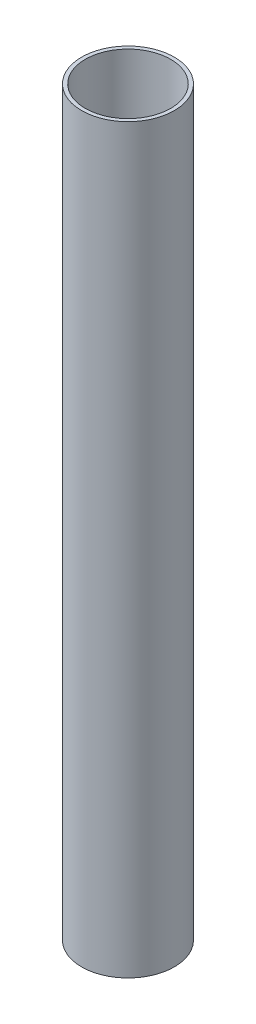
ISO-10303-21;
HEADER;
FILE_DESCRIPTION(('STEP AP214'),'2;1');
FILE_NAME('part.step','',(''),(''),'','','');
FILE_SCHEMA(('AUTOMOTIVE_DESIGN { 1 0 10303 214 1 1 1 1 }'));
ENDSEC;
DATA;
#1=APPLICATION_CONTEXT('core data for automotive mechanical design processes');
#2=APPLICATION_PROTOCOL_DEFINITION('international standard','automotive_design',2000,#1);
#3=PRODUCT_CONTEXT('',#1,'mechanical');
#4=PRODUCT('Part','Part','',(#3));
#5=PRODUCT_RELATED_PRODUCT_CATEGORY('part','',(#4));
#6=PRODUCT_DEFINITION_FORMATION('','',#4);
#7=PRODUCT_DEFINITION_CONTEXT('part definition',#1,'design');
#8=PRODUCT_DEFINITION('design','',#6,#7);
#9=PRODUCT_DEFINITION_SHAPE('','',#8);
#10=(LENGTH_UNIT() NAMED_UNIT(*) SI_UNIT(.MILLI.,.METRE.));
#11=(NAMED_UNIT(*) PLANE_ANGLE_UNIT() SI_UNIT($,.RADIAN.));
#12=(NAMED_UNIT(*) SI_UNIT($,.STERADIAN.) SOLID_ANGLE_UNIT());
#13=UNCERTAINTY_MEASURE_WITH_UNIT(LENGTH_MEASURE(1.E-05),#10,'distance_accuracy_value','');
#14=(GEOMETRIC_REPRESENTATION_CONTEXT(3) GLOBAL_UNCERTAINTY_ASSIGNED_CONTEXT((#13)) GLOBAL_UNIT_ASSIGNED_CONTEXT((#10,
#11,#12)) REPRESENTATION_CONTEXT('',''));
#15=CARTESIAN_POINT('',(0.,0.,0.));
#16=DIRECTION('',(0.,0.,1.));
#17=DIRECTION('',(1.,0.,0.));
#18=AXIS2_PLACEMENT_3D('',#15,#16,#17);
#19=CARTESIAN_POINT('',(0.,200.,0.));
#20=DIRECTION('',(0.,1.,0.));
#21=DIRECTION('',(0.,0.,1.));
#22=AXIS2_PLACEMENT_3D('',#19,#20,#21);
#23=PLANE('',#22);
#24=CARTESIAN_POINT('',(0.,200.,0.));
#25=DIRECTION('',(0.,1.,0.));
#26=DIRECTION('',(0.,0.,1.));
#27=AXIS2_PLACEMENT_3D('',#24,#25,#26);
#28=CIRCLE('',#27,12.5);
#29=CARTESIAN_POINT('',(0.,200.,12.5));
#30=VERTEX_POINT('',#29);
#31=EDGE_CURVE('E10',#30,#30,#28,.T.);
#32=ORIENTED_EDGE('',*,*,#31,.T.);
#33=EDGE_LOOP('',(#32));
#34=FACE_BOUND('',#33,.T.);
#35=CARTESIAN_POINT('',(0.,200.,0.));
#36=DIRECTION('',(0.,1.,0.));
#37=DIRECTION('',(0.,0.,1.));
#38=AXIS2_PLACEMENT_3D('',#35,#36,#37);
#39=CIRCLE('',#38,11.5);
#40=CARTESIAN_POINT('',(0.,200.,11.5));
#41=VERTEX_POINT('',#40);
#42=EDGE_CURVE('E58',#41,#41,#39,.T.);
#43=ORIENTED_EDGE('',*,*,#42,.F.);
#44=EDGE_LOOP('',(#43));
#45=FACE_BOUND('',#44,.T.);
#46=ADVANCED_FACE('F45',(#34,#45),#23,.T.);
#47=CARTESIAN_POINT('',(0.,0.,0.));
#48=DIRECTION('',(0.,1.,0.));
#49=DIRECTION('',(0.,0.,1.));
#50=AXIS2_PLACEMENT_3D('',#47,#48,#49);
#51=PLANE('',#50);
#52=CARTESIAN_POINT('',(0.,0.,0.));
#53=DIRECTION('',(0.,1.,0.));
#54=DIRECTION('',(0.,0.,1.));
#55=AXIS2_PLACEMENT_3D('',#52,#53,#54);
#56=CIRCLE('',#55,12.5);
#57=CARTESIAN_POINT('',(0.,0.,12.5));
#58=VERTEX_POINT('',#57);
#59=EDGE_CURVE('E49',#58,#58,#56,.T.);
#60=ORIENTED_EDGE('',*,*,#59,.F.);
#61=EDGE_LOOP('',(#60));
#62=FACE_BOUND('',#61,.T.);
#63=CARTESIAN_POINT('',(0.,0.,0.));
#64=DIRECTION('',(0.,1.,0.));
#65=DIRECTION('',(0.,0.,1.));
#66=AXIS2_PLACEMENT_3D('',#63,#64,#65);
#67=CIRCLE('',#66,11.5);
#68=CARTESIAN_POINT('',(0.,0.,11.5));
#69=VERTEX_POINT('',#68);
#70=EDGE_CURVE('E60',#69,#69,#67,.T.);
#71=ORIENTED_EDGE('',*,*,#70,.T.);
#72=EDGE_LOOP('',(#71));
#73=FACE_BOUND('',#72,.T.);
#74=ADVANCED_FACE('F72',(#62,#73),#51,.F.);
#75=CARTESIAN_POINT('',(0.,200.,0.));
#76=DIRECTION('',(0.,-1.,0.));
#77=DIRECTION('',(0.,0.,-1.));
#78=AXIS2_PLACEMENT_3D('',#75,#76,#77);
#79=CYLINDRICAL_SURFACE('',#78,12.5);
#80=ORIENTED_EDGE('',*,*,#31,.F.);
#81=EDGE_LOOP('',(#80));
#82=FACE_BOUND('',#81,.T.);
#83=ORIENTED_EDGE('',*,*,#59,.T.);
#84=EDGE_LOOP('',(#83));
#85=FACE_BOUND('',#84,.T.);
#86=ADVANCED_FACE('F47',(#82,#85),#79,.T.);
#87=CARTESIAN_POINT('',(0.,200.,0.));
#88=DIRECTION('',(0.,-1.,0.));
#89=DIRECTION('',(0.,0.,-1.));
#90=AXIS2_PLACEMENT_3D('',#87,#88,#89);
#91=CYLINDRICAL_SURFACE('',#90,11.5);
#92=ORIENTED_EDGE('',*,*,#42,.T.);
#93=EDGE_LOOP('',(#92));
#94=FACE_BOUND('',#93,.T.);
#95=ORIENTED_EDGE('',*,*,#70,.F.);
#96=EDGE_LOOP('',(#95));
#97=FACE_BOUND('',#96,.T.);
#98=ADVANCED_FACE('F68',(#94,#97),#91,.F.);
#99=CLOSED_SHELL('',(#46,#74,#86,#98));
#100=MANIFOLD_SOLID_BREP('B2',#99);
#101=ADVANCED_BREP_SHAPE_REPRESENTATION('',(#18,#100),#14);
#102=SHAPE_DEFINITION_REPRESENTATION(#9,#101);
ENDSEC;
END-ISO-10303-21;
